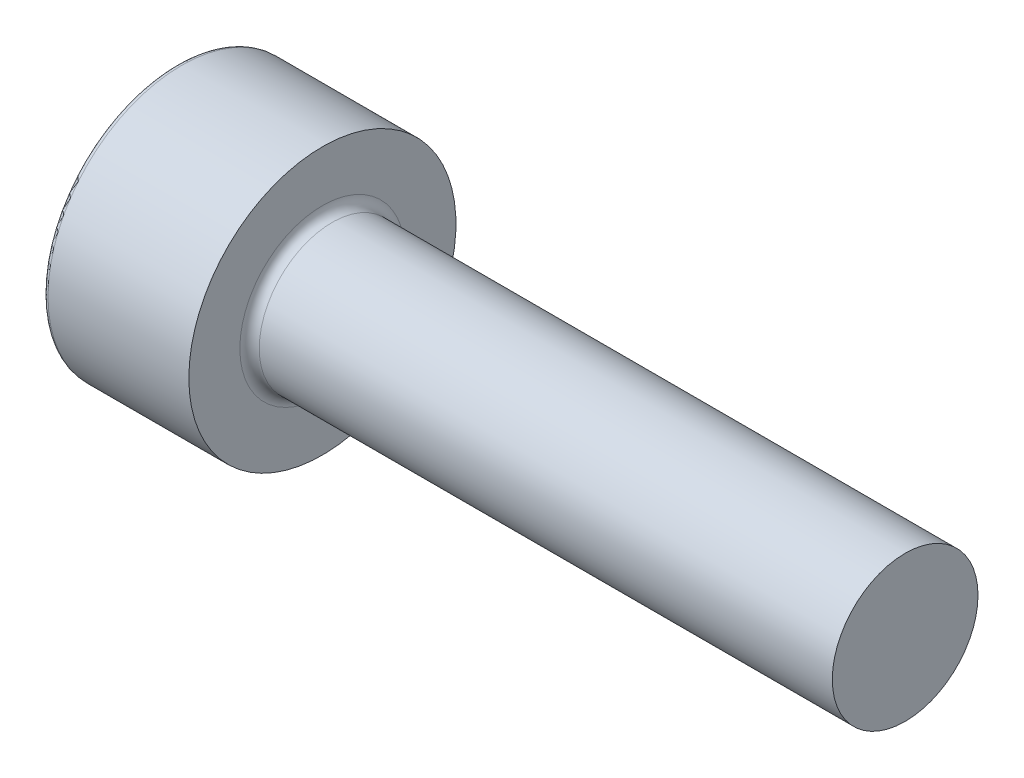
ISO-10303-21;
HEADER;
FILE_DESCRIPTION(('STEP AP214'),'2;1');
FILE_NAME('part.step','',(''),(''),'','','');
FILE_SCHEMA(('AUTOMOTIVE_DESIGN { 1 0 10303 214 1 1 1 1 }'));
ENDSEC;
DATA;
#1=APPLICATION_CONTEXT('core data for automotive mechanical design processes');
#2=APPLICATION_PROTOCOL_DEFINITION('international standard','automotive_design',2000,#1);
#3=PRODUCT_CONTEXT('',#1,'mechanical');
#4=PRODUCT('Part','Part','',(#3));
#5=PRODUCT_RELATED_PRODUCT_CATEGORY('part','',(#4));
#6=PRODUCT_DEFINITION_FORMATION('','',#4);
#7=PRODUCT_DEFINITION_CONTEXT('part definition',#1,'design');
#8=PRODUCT_DEFINITION('design','',#6,#7);
#9=PRODUCT_DEFINITION_SHAPE('','',#8);
#10=(LENGTH_UNIT() NAMED_UNIT(*) SI_UNIT(.MILLI.,.METRE.));
#11=(NAMED_UNIT(*) PLANE_ANGLE_UNIT() SI_UNIT($,.RADIAN.));
#12=(NAMED_UNIT(*) SI_UNIT($,.STERADIAN.) SOLID_ANGLE_UNIT());
#13=UNCERTAINTY_MEASURE_WITH_UNIT(LENGTH_MEASURE(1.E-05),#10,'distance_accuracy_value','');
#14=(GEOMETRIC_REPRESENTATION_CONTEXT(3) GLOBAL_UNCERTAINTY_ASSIGNED_CONTEXT((#13)) GLOBAL_UNIT_ASSIGNED_CONTEXT((#10,
#11,#12)) REPRESENTATION_CONTEXT('',''));
#15=CARTESIAN_POINT('',(0.,0.,0.));
#16=DIRECTION('',(0.,0.,1.));
#17=DIRECTION('',(1.,0.,0.));
#18=AXIS2_PLACEMENT_3D('',#15,#16,#17);
#19=CARTESIAN_POINT('',(0.,0.,0.));
#20=DIRECTION('',(-1.,0.,0.));
#21=DIRECTION('',(0.,0.,1.));
#22=AXIS2_PLACEMENT_3D('',#19,#20,#21);
#23=CYLINDRICAL_SURFACE('',#22,1.5);
#24=CARTESIAN_POINT('',(3.2,0.,0.));
#25=DIRECTION('',(-1.,0.,0.));
#26=DIRECTION('',(0.,0.,1.));
#27=AXIS2_PLACEMENT_3D('',#24,#25,#26);
#28=CIRCLE('',#27,1.5);
#29=CARTESIAN_POINT('',(3.2,0.,1.5));
#30=VERTEX_POINT('',#29);
#31=EDGE_CURVE('E141',#30,#30,#28,.T.);
#32=ORIENTED_EDGE('',*,*,#31,.F.);
#33=EDGE_LOOP('',(#32));
#34=FACE_BOUND('',#33,.T.);
#35=CARTESIAN_POINT('',(15.,0.,0.));
#36=DIRECTION('',(1.,0.,0.));
#37=DIRECTION('',(0.,0.,-1.));
#38=AXIS2_PLACEMENT_3D('',#35,#36,#37);
#39=CIRCLE('',#38,1.5);
#40=CARTESIAN_POINT('',(15.,0.,-1.5));
#41=VERTEX_POINT('',#40);
#42=EDGE_CURVE('E42',#41,#41,#39,.T.);
#43=ORIENTED_EDGE('',*,*,#42,.F.);
#44=EDGE_LOOP('',(#43));
#45=FACE_BOUND('',#44,.T.);
#46=ADVANCED_FACE('F38',(#34,#45),#23,.T.);
#47=CARTESIAN_POINT('',(0.,0.,0.));
#48=DIRECTION('',(1.,0.,0.));
#49=DIRECTION('',(0.,0.,-1.));
#50=AXIS2_PLACEMENT_3D('',#47,#48,#49);
#51=PLANE('',#50);
#52=CARTESIAN_POINT('',(0.,0.,0.));
#53=DIRECTION('',(1.,0.,0.));
#54=DIRECTION('',(0.,0.,-1.));
#55=AXIS2_PLACEMENT_3D('',#52,#53,#54);
#56=CIRCLE('',#55,2.65);
#57=CARTESIAN_POINT('',(0.,0.,-2.65));
#58=VERTEX_POINT('',#57);
#59=EDGE_CURVE('E47',#58,#58,#56,.F.);
#60=ORIENTED_EDGE('',*,*,#59,.T.);
#61=EDGE_LOOP('',(#60));
#62=FACE_BOUND('',#61,.T.);
#63=DIRECTION('',(0.,0.866025403784439,-0.5));
#64=VECTOR('',#63,1.);
#65=CARTESIAN_POINT('',(0.,0.,1.435));
#66=LINE('',#65,#64);
#67=CARTESIAN_POINT('',(0.,0.,1.435));
#68=VERTEX_POINT('',#67);
#69=CARTESIAN_POINT('',(0.,1.24274645443067,0.717499999999999));
#70=VERTEX_POINT('',#69);
#71=EDGE_CURVE('E128',#68,#70,#66,.T.);
#72=ORIENTED_EDGE('',*,*,#71,.F.);
#73=DIRECTION('',(0.,0.866025403784439,0.5));
#74=VECTOR('',#73,1.);
#75=CARTESIAN_POINT('',(0.,-1.24274645443067,0.7175));
#76=LINE('',#75,#74);
#77=CARTESIAN_POINT('',(0.,-1.24274645443067,0.7175));
#78=VERTEX_POINT('',#77);
#79=EDGE_CURVE('E54',#78,#68,#76,.T.);
#80=ORIENTED_EDGE('',*,*,#79,.F.);
#81=DIRECTION('',(0.,0.,1.));
#82=VECTOR('',#81,1.);
#83=CARTESIAN_POINT('',(0.,-1.24274645443067,-0.7175));
#84=LINE('',#83,#82);
#85=CARTESIAN_POINT('',(0.,-1.24274645443067,-0.7175));
#86=VERTEX_POINT('',#85);
#87=EDGE_CURVE('E137',#86,#78,#84,.T.);
#88=ORIENTED_EDGE('',*,*,#87,.F.);
#89=DIRECTION('',(0.,-0.866025403784439,0.5));
#90=VECTOR('',#89,1.);
#91=CARTESIAN_POINT('',(0.,0.,-1.435));
#92=LINE('',#91,#90);
#93=CARTESIAN_POINT('',(0.,0.,-1.435));
#94=VERTEX_POINT('',#93);
#95=EDGE_CURVE('E135',#94,#86,#92,.T.);
#96=ORIENTED_EDGE('',*,*,#95,.F.);
#97=DIRECTION('',(0.,-0.866025403784439,-0.5));
#98=VECTOR('',#97,1.);
#99=CARTESIAN_POINT('',(0.,1.24274645443067,-0.7175));
#100=LINE('',#99,#98);
#101=CARTESIAN_POINT('',(0.,1.24274645443067,-0.7175));
#102=VERTEX_POINT('',#101);
#103=EDGE_CURVE('E102',#102,#94,#100,.T.);
#104=ORIENTED_EDGE('',*,*,#103,.F.);
#105=DIRECTION('',(0.,0.,-1.));
#106=VECTOR('',#105,1.);
#107=CARTESIAN_POINT('',(0.,1.24274645443067,0.717499999999999));
#108=LINE('',#107,#106);
#109=EDGE_CURVE('E131',#70,#102,#108,.T.);
#110=ORIENTED_EDGE('',*,*,#109,.F.);
#111=EDGE_LOOP('',(#72,#80,#88,#96,#104,#110));
#112=FACE_BOUND('',#111,.T.);
#113=ADVANCED_FACE('F158',(#62,#112),#51,.F.);
#114=CARTESIAN_POINT('',(0.,0.,0.));
#115=DIRECTION('',(-1.,0.,0.));
#116=DIRECTION('',(0.,0.,1.));
#117=AXIS2_PLACEMENT_3D('',#114,#115,#116);
#118=CYLINDRICAL_SURFACE('',#117,2.75);
#119=CARTESIAN_POINT('',(0.1,0.,0.));
#120=DIRECTION('',(1.,0.,0.));
#121=DIRECTION('',(0.,0.,-1.));
#122=AXIS2_PLACEMENT_3D('',#119,#120,#121);
#123=CIRCLE('',#122,2.75);
#124=CARTESIAN_POINT('',(0.1,0.,-2.75));
#125=VERTEX_POINT('',#124);
#126=EDGE_CURVE('E11',#125,#125,#123,.T.);
#127=ORIENTED_EDGE('',*,*,#126,.T.);
#128=EDGE_LOOP('',(#127));
#129=FACE_BOUND('',#128,.T.);
#130=CARTESIAN_POINT('',(3.,0.,0.));
#131=DIRECTION('',(-1.,0.,0.));
#132=DIRECTION('',(0.,0.,1.));
#133=AXIS2_PLACEMENT_3D('',#130,#131,#132);
#134=CIRCLE('',#133,2.75);
#135=CARTESIAN_POINT('',(3.,0.,2.75));
#136=VERTEX_POINT('',#135);
#137=EDGE_CURVE('E152',#136,#136,#134,.T.);
#138=ORIENTED_EDGE('',*,*,#137,.T.);
#139=EDGE_LOOP('',(#138));
#140=FACE_BOUND('',#139,.T.);
#141=ADVANCED_FACE('F180',(#129,#140),#118,.T.);
#142=CARTESIAN_POINT('',(3.,2.75,0.));
#143=DIRECTION('',(-1.,0.,0.));
#144=DIRECTION('',(0.,0.,1.));
#145=AXIS2_PLACEMENT_3D('',#142,#143,#144);
#146=PLANE('',#145);
#147=ORIENTED_EDGE('',*,*,#137,.F.);
#148=EDGE_LOOP('',(#147));
#149=FACE_BOUND('',#148,.T.);
#150=CARTESIAN_POINT('',(3.,0.,0.));
#151=DIRECTION('',(-1.,0.,0.));
#152=DIRECTION('',(0.,0.,1.));
#153=AXIS2_PLACEMENT_3D('',#150,#151,#152);
#154=CIRCLE('',#153,1.7);
#155=CARTESIAN_POINT('',(3.,0.,1.7));
#156=VERTEX_POINT('',#155);
#157=EDGE_CURVE('E149',#156,#156,#154,.T.);
#158=ORIENTED_EDGE('',*,*,#157,.T.);
#159=EDGE_LOOP('',(#158));
#160=FACE_BOUND('',#159,.T.);
#161=ADVANCED_FACE('F190',(#149,#160),#146,.F.);
#162=CARTESIAN_POINT('',(3.2,0.,0.));
#163=DIRECTION('',(-1.,0.,0.));
#164=DIRECTION('',(0.,0.,1.));
#165=AXIS2_PLACEMENT_3D('',#162,#163,#164);
#166=TOROIDAL_SURFACE('',#165,1.7,0.2);
#167=ORIENTED_EDGE('',*,*,#157,.F.);
#168=EDGE_LOOP('',(#167));
#169=FACE_BOUND('',#168,.T.);
#170=ORIENTED_EDGE('',*,*,#31,.T.);
#171=EDGE_LOOP('',(#170));
#172=FACE_BOUND('',#171,.T.);
#173=ADVANCED_FACE('F187',(#169,#172),#166,.F.);
#174=CARTESIAN_POINT('',(1.3,-1.24274645443067,0.7175));
#175=DIRECTION('',(0.,-0.5,0.866025403784439));
#176=DIRECTION('',(0.,-0.866025403784439,-0.5));
#177=AXIS2_PLACEMENT_3D('',#174,#175,#176);
#178=PLANE('',#177);
#179=ORIENTED_EDGE('',*,*,#79,.T.);
#180=DIRECTION('',(-1.,0.,0.));
#181=VECTOR('',#180,1.);
#182=CARTESIAN_POINT('',(1.3,0.,1.435));
#183=LINE('',#182,#181);
#184=CARTESIAN_POINT('',(1.3,0.,1.435));
#185=VERTEX_POINT('',#184);
#186=EDGE_CURVE('E84',#185,#68,#183,.T.);
#187=ORIENTED_EDGE('',*,*,#186,.F.);
#188=DIRECTION('',(0.,0.866025403784439,0.5));
#189=VECTOR('',#188,1.);
#190=CARTESIAN_POINT('',(1.3,-1.24274645443067,0.7175));
#191=LINE('',#190,#189);
#192=CARTESIAN_POINT('',(1.3,-1.24274645443067,0.7175));
#193=VERTEX_POINT('',#192);
#194=EDGE_CURVE('E139',#193,#185,#191,.T.);
#195=ORIENTED_EDGE('',*,*,#194,.F.);
#196=DIRECTION('',(-1.,0.,0.));
#197=VECTOR('',#196,1.);
#198=CARTESIAN_POINT('',(1.3,-1.24274645443067,0.7175));
#199=LINE('',#198,#197);
#200=EDGE_CURVE('E62',#193,#78,#199,.T.);
#201=ORIENTED_EDGE('',*,*,#200,.T.);
#202=EDGE_LOOP('',(#179,#187,#195,#201));
#203=FACE_BOUND('',#202,.T.);
#204=ADVANCED_FACE('F185',(#203),#178,.F.);
#205=CARTESIAN_POINT('',(1.3,-1.24274645443067,-0.7175));
#206=DIRECTION('',(0.,-1.,0.));
#207=DIRECTION('',(0.,0.,-1.));
#208=AXIS2_PLACEMENT_3D('',#205,#206,#207);
#209=PLANE('',#208);
#210=ORIENTED_EDGE('',*,*,#87,.T.);
#211=ORIENTED_EDGE('',*,*,#200,.F.);
#212=DIRECTION('',(0.,0.,1.));
#213=VECTOR('',#212,1.);
#214=CARTESIAN_POINT('',(1.3,-1.24274645443067,-0.7175));
#215=LINE('',#214,#213);
#216=CARTESIAN_POINT('',(1.3,-1.24274645443067,-0.7175));
#217=VERTEX_POINT('',#216);
#218=EDGE_CURVE('E114',#217,#193,#215,.T.);
#219=ORIENTED_EDGE('',*,*,#218,.F.);
#220=DIRECTION('',(-1.,0.,0.));
#221=VECTOR('',#220,1.);
#222=CARTESIAN_POINT('',(1.3,-1.24274645443067,-0.7175));
#223=LINE('',#222,#221);
#224=EDGE_CURVE('E106',#217,#86,#223,.T.);
#225=ORIENTED_EDGE('',*,*,#224,.T.);
#226=EDGE_LOOP('',(#210,#211,#219,#225));
#227=FACE_BOUND('',#226,.T.);
#228=ADVANCED_FACE('F220',(#227),#209,.F.);
#229=CARTESIAN_POINT('',(1.3,0.,-1.435));
#230=DIRECTION('',(0.,-0.5,-0.866025403784439));
#231=DIRECTION('',(0.,0.866025403784439,-0.5));
#232=AXIS2_PLACEMENT_3D('',#229,#230,#231);
#233=PLANE('',#232);
#234=ORIENTED_EDGE('',*,*,#95,.T.);
#235=ORIENTED_EDGE('',*,*,#224,.F.);
#236=DIRECTION('',(0.,-0.866025403784439,0.5));
#237=VECTOR('',#236,1.);
#238=CARTESIAN_POINT('',(1.3,0.,-1.435));
#239=LINE('',#238,#237);
#240=CARTESIAN_POINT('',(1.3,0.,-1.435));
#241=VERTEX_POINT('',#240);
#242=EDGE_CURVE('E110',#241,#217,#239,.T.);
#243=ORIENTED_EDGE('',*,*,#242,.F.);
#244=DIRECTION('',(-1.,0.,0.));
#245=VECTOR('',#244,1.);
#246=CARTESIAN_POINT('',(1.3,0.,-1.435));
#247=LINE('',#246,#245);
#248=EDGE_CURVE('E95',#241,#94,#247,.T.);
#249=ORIENTED_EDGE('',*,*,#248,.T.);
#250=EDGE_LOOP('',(#234,#235,#243,#249));
#251=FACE_BOUND('',#250,.T.);
#252=ADVANCED_FACE('F111',(#251),#233,.F.);
#253=CARTESIAN_POINT('',(1.3,1.24274645443067,-0.7175));
#254=DIRECTION('',(0.,0.5,-0.866025403784439));
#255=DIRECTION('',(0.,0.866025403784439,0.5));
#256=AXIS2_PLACEMENT_3D('',#253,#254,#255);
#257=PLANE('',#256);
#258=ORIENTED_EDGE('',*,*,#103,.T.);
#259=ORIENTED_EDGE('',*,*,#248,.F.);
#260=DIRECTION('',(0.,-0.866025403784439,-0.5));
#261=VECTOR('',#260,1.);
#262=CARTESIAN_POINT('',(1.3,1.24274645443067,-0.7175));
#263=LINE('',#262,#261);
#264=CARTESIAN_POINT('',(1.3,1.24274645443067,-0.7175));
#265=VERTEX_POINT('',#264);
#266=EDGE_CURVE('E99',#265,#241,#263,.T.);
#267=ORIENTED_EDGE('',*,*,#266,.F.);
#268=DIRECTION('',(-1.,0.,0.));
#269=VECTOR('',#268,1.);
#270=CARTESIAN_POINT('',(1.3,1.24274645443067,-0.7175));
#271=LINE('',#270,#269);
#272=EDGE_CURVE('E107',#265,#102,#271,.T.);
#273=ORIENTED_EDGE('',*,*,#272,.T.);
#274=EDGE_LOOP('',(#258,#259,#267,#273));
#275=FACE_BOUND('',#274,.T.);
#276=ADVANCED_FACE('F97',(#275),#257,.F.);
#277=CARTESIAN_POINT('',(1.3,1.24274645443067,0.717499999999999));
#278=DIRECTION('',(0.,1.,0.));
#279=DIRECTION('',(0.,0.,1.));
#280=AXIS2_PLACEMENT_3D('',#277,#278,#279);
#281=PLANE('',#280);
#282=ORIENTED_EDGE('',*,*,#109,.T.);
#283=ORIENTED_EDGE('',*,*,#272,.F.);
#284=DIRECTION('',(0.,0.,-1.));
#285=VECTOR('',#284,1.);
#286=CARTESIAN_POINT('',(1.3,1.24274645443067,0.717499999999999));
#287=LINE('',#286,#285);
#288=CARTESIAN_POINT('',(1.3,1.24274645443067,0.717499999999999));
#289=VERTEX_POINT('',#288);
#290=EDGE_CURVE('E120',#289,#265,#287,.T.);
#291=ORIENTED_EDGE('',*,*,#290,.F.);
#292=DIRECTION('',(-1.,0.,0.));
#293=VECTOR('',#292,1.);
#294=CARTESIAN_POINT('',(1.3,1.24274645443067,0.717499999999999));
#295=LINE('',#294,#293);
#296=EDGE_CURVE('E144',#289,#70,#295,.T.);
#297=ORIENTED_EDGE('',*,*,#296,.T.);
#298=EDGE_LOOP('',(#282,#283,#291,#297));
#299=FACE_BOUND('',#298,.T.);
#300=ADVANCED_FACE('F238',(#299),#281,.F.);
#301=CARTESIAN_POINT('',(1.3,0.,1.435));
#302=DIRECTION('',(0.,0.5,0.866025403784439));
#303=DIRECTION('',(0.,-0.866025403784439,0.5));
#304=AXIS2_PLACEMENT_3D('',#301,#302,#303);
#305=PLANE('',#304);
#306=ORIENTED_EDGE('',*,*,#71,.T.);
#307=ORIENTED_EDGE('',*,*,#296,.F.);
#308=DIRECTION('',(0.,0.866025403784439,-0.5));
#309=VECTOR('',#308,1.);
#310=CARTESIAN_POINT('',(1.3,0.,1.435));
#311=LINE('',#310,#309);
#312=EDGE_CURVE('E122',#185,#289,#311,.T.);
#313=ORIENTED_EDGE('',*,*,#312,.F.);
#314=ORIENTED_EDGE('',*,*,#186,.T.);
#315=EDGE_LOOP('',(#306,#307,#313,#314));
#316=FACE_BOUND('',#315,.T.);
#317=ADVANCED_FACE('F171',(#316),#305,.F.);
#318=CARTESIAN_POINT('',(1.3,-1.24274645443067,0.7175));
#319=DIRECTION('',(1.,0.,0.));
#320=DIRECTION('',(0.,0.,-1.));
#321=AXIS2_PLACEMENT_3D('',#318,#319,#320);
#322=PLANE('',#321);
#323=ORIENTED_EDGE('',*,*,#194,.T.);
#324=ORIENTED_EDGE('',*,*,#312,.T.);
#325=ORIENTED_EDGE('',*,*,#290,.T.);
#326=ORIENTED_EDGE('',*,*,#266,.T.);
#327=ORIENTED_EDGE('',*,*,#242,.T.);
#328=ORIENTED_EDGE('',*,*,#218,.T.);
#329=EDGE_LOOP('',(#323,#324,#325,#326,#327,#328));
#330=FACE_BOUND('',#329,.T.);
#331=ADVANCED_FACE('F117',(#330),#322,.F.);
#332=CARTESIAN_POINT('',(0.1,0.,0.));
#333=DIRECTION('',(1.,0.,0.));
#334=DIRECTION('',(0.,0.,-1.));
#335=AXIS2_PLACEMENT_3D('',#332,#333,#334);
#336=TOROIDAL_SURFACE('',#335,2.65,0.1);
#337=ORIENTED_EDGE('',*,*,#126,.F.);
#338=EDGE_LOOP('',(#337));
#339=FACE_BOUND('',#338,.T.);
#340=ORIENTED_EDGE('',*,*,#59,.F.);
#341=EDGE_LOOP('',(#340));
#342=FACE_BOUND('',#341,.T.);
#343=ADVANCED_FACE('F40',(#339,#342),#336,.T.);
#344=CARTESIAN_POINT('',(15.,-0.473670518515646,0.109117815783722));
#345=DIRECTION('',(1.,0.,0.));
#346=DIRECTION('',(0.,0.,-1.));
#347=AXIS2_PLACEMENT_3D('',#344,#345,#346);
#348=PLANE('',#347);
#349=ORIENTED_EDGE('',*,*,#42,.T.);
#350=EDGE_LOOP('',(#349));
#351=FACE_BOUND('',#350,.T.);
#352=ADVANCED_FACE('F162',(#351),#348,.T.);
#353=CLOSED_SHELL('',(#46,#113,#141,#161,#173,#204,#228,#252,#276,#300,#317,#331,#343,#352));
#354=MANIFOLD_SOLID_BREP('B2',#353);
#355=ADVANCED_BREP_SHAPE_REPRESENTATION('',(#18,#354),#14);
#356=SHAPE_DEFINITION_REPRESENTATION(#9,#355);
ENDSEC;
END-ISO-10303-21;
